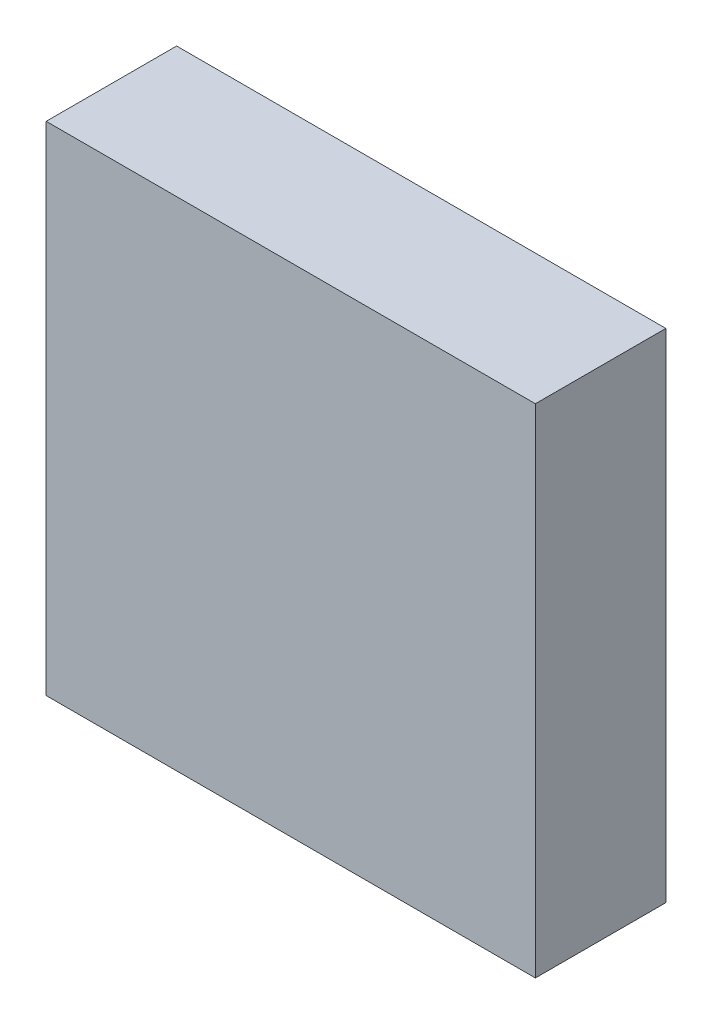
ISO-10303-21;
HEADER;
FILE_DESCRIPTION(('STEP AP214'),'2;1');
FILE_NAME('part.step','',(''),(''),'','','');
FILE_SCHEMA(('AUTOMOTIVE_DESIGN { 1 0 10303 214 1 1 1 1 }'));
ENDSEC;
DATA;
#1=APPLICATION_CONTEXT('core data for automotive mechanical design processes');
#2=APPLICATION_PROTOCOL_DEFINITION('international standard','automotive_design',2000,#1);
#3=PRODUCT_CONTEXT('',#1,'mechanical');
#4=PRODUCT('Part','Part','',(#3));
#5=PRODUCT_RELATED_PRODUCT_CATEGORY('part','',(#4));
#6=PRODUCT_DEFINITION_FORMATION('','',#4);
#7=PRODUCT_DEFINITION_CONTEXT('part definition',#1,'design');
#8=PRODUCT_DEFINITION('design','',#6,#7);
#9=PRODUCT_DEFINITION_SHAPE('','',#8);
#10=(LENGTH_UNIT() NAMED_UNIT(*) SI_UNIT(.MILLI.,.METRE.));
#11=(NAMED_UNIT(*) PLANE_ANGLE_UNIT() SI_UNIT($,.RADIAN.));
#12=(NAMED_UNIT(*) SI_UNIT($,.STERADIAN.) SOLID_ANGLE_UNIT());
#13=UNCERTAINTY_MEASURE_WITH_UNIT(LENGTH_MEASURE(1.E-05),#10,'distance_accuracy_value','');
#14=(GEOMETRIC_REPRESENTATION_CONTEXT(3) GLOBAL_UNCERTAINTY_ASSIGNED_CONTEXT((#13)) GLOBAL_UNIT_ASSIGNED_CONTEXT((#10,
#11,#12)) REPRESENTATION_CONTEXT('',''));
#15=CARTESIAN_POINT('',(0.,0.,0.));
#16=DIRECTION('',(0.,0.,1.));
#17=DIRECTION('',(1.,0.,0.));
#18=AXIS2_PLACEMENT_3D('',#15,#16,#17);
#19=CARTESIAN_POINT('',(-78.3793602910264,-15.7187201468237,2.85762877069288));
#20=DIRECTION('',(-0.999999998763975,2.36279123509077E-06,4.96635296327949E-05));
#21=DIRECTION('',(2.36279123800464E-06,0.999999999997209,0.));
#22=AXIS2_PLACEMENT_3D('',#19,#20,#21);
#23=PLANE('',#22);
#24=DIRECTION('',(-2.36279123509078E-06,-0.999999999997209,5.86721442872066E-11));
#25=VECTOR('',#24,1.);
#26=CARTESIAN_POINT('',(-78.3793602910264,-15.7187201468237,2.85762877069288));
#27=LINE('',#26,#25);
#28=CARTESIAN_POINT('',(-78.3793602910264,-15.7187201468237,2.85762877069288));
#29=VERTEX_POINT('',#28);
#30=CARTESIAN_POINT('',(-78.3793674975432,-18.7687216668152,2.85762877087183));
#31=VERTEX_POINT('',#30);
#32=EDGE_CURVE('E82',#29,#31,#27,.T.);
#33=ORIENTED_EDGE('',*,*,#32,.T.);
#34=DIRECTION('',(-4.96635296327949E-05,5.86724083053525E-11,-0.999999998766767));
#35=VECTOR('',#34,1.);
#36=CARTESIAN_POINT('',(-78.3793674975432,-18.7687216668152,2.85762877087183));
#37=LINE('',#36,#35);
#38=CARTESIAN_POINT('',(-78.3794072284136,-18.7687216667683,2.05762783185842));
#39=VERTEX_POINT('',#38);
#40=EDGE_CURVE('E11',#31,#39,#37,.T.);
#41=ORIENTED_EDGE('',*,*,#40,.T.);
#42=DIRECTION('',(-2.36279123509078E-06,-0.999999999997209,5.86721442872066E-11));
#43=VECTOR('',#42,1.);
#44=CARTESIAN_POINT('',(-78.3794000218968,-15.7187201467768,2.05762783167947));
#45=LINE('',#44,#43);
#46=CARTESIAN_POINT('',(-78.3794000218968,-15.7187201467768,2.05762783167947));
#47=VERTEX_POINT('',#46);
#48=EDGE_CURVE('E88',#47,#39,#45,.T.);
#49=ORIENTED_EDGE('',*,*,#48,.F.);
#50=DIRECTION('',(-4.96635296327949E-05,5.86724083053525E-11,-0.999999998766767));
#51=VECTOR('',#50,1.);
#52=CARTESIAN_POINT('',(-78.3793602910264,-15.7187201468237,2.85762877069288));
#53=LINE('',#52,#51);
#54=EDGE_CURVE('E70',#29,#47,#53,.T.);
#55=ORIENTED_EDGE('',*,*,#54,.F.);
#56=EDGE_LOOP('',(#33,#41,#49,#55));
#57=FACE_BOUND('',#56,.T.);
#58=ADVANCED_FACE('F17',(#57),#23,.F.);
#59=CARTESIAN_POINT('',(-78.3793674975432,-18.7687216668152,2.85762877087183));
#60=DIRECTION('',(2.36279123509078E-06,0.999999999997209,-5.86721442872066E-11));
#61=DIRECTION('',(-2.4831708954119E-05,0.,-0.999999999691693));
#62=AXIS2_PLACEMENT_3D('',#59,#60,#61);
#63=PLANE('',#62);
#64=DIRECTION('',(-0.999999998763976,2.36279123509077E-06,4.96635296327949E-05));
#65=VECTOR('',#64,1.);
#66=CARTESIAN_POINT('',(-78.3793674975432,-18.7687216668152,2.85762877087183));
#67=LINE('',#66,#65);
#68=CARTESIAN_POINT('',(-81.3793665738352,-18.7687145784437,2.85777776141504));
#69=VERTEX_POINT('',#68);
#70=EDGE_CURVE('E101',#31,#69,#67,.T.);
#71=ORIENTED_EDGE('',*,*,#70,.T.);
#72=DIRECTION('',(-4.96635296327949E-05,5.86724083053525E-11,-0.999999998766767));
#73=VECTOR('',#72,1.);
#74=CARTESIAN_POINT('',(-81.3793665738352,-18.7687145784437,2.85777776141504));
#75=LINE('',#74,#73);
#76=CARTESIAN_POINT('',(-81.3794063047055,-18.7687145783967,2.05777682240163));
#77=VERTEX_POINT('',#76);
#78=EDGE_CURVE('E25',#69,#77,#75,.T.);
#79=ORIENTED_EDGE('',*,*,#78,.T.);
#80=DIRECTION('',(-0.999999998763976,2.36279123509077E-06,4.96635296327949E-05));
#81=VECTOR('',#80,1.);
#82=CARTESIAN_POINT('',(-78.3794072284136,-18.7687216667683,2.05762783185842));
#83=LINE('',#82,#81);
#84=EDGE_CURVE('E93',#39,#77,#83,.T.);
#85=ORIENTED_EDGE('',*,*,#84,.F.);
#86=ORIENTED_EDGE('',*,*,#40,.F.);
#87=EDGE_LOOP('',(#71,#79,#85,#86));
#88=FACE_BOUND('',#87,.T.);
#89=ADVANCED_FACE('F117',(#88),#63,.F.);
#90=CARTESIAN_POINT('',(-81.3793665738352,-18.7687145784437,2.85777776141504));
#91=DIRECTION('',(0.999999998763975,-2.36279123509077E-06,-4.96635296327949E-05));
#92=DIRECTION('',(0.,-0.998870180553423,0.0475222305997091));
#93=AXIS2_PLACEMENT_3D('',#90,#91,#92);
#94=PLANE('',#93);
#95=DIRECTION('',(2.36279123509078E-06,0.999999999997209,-5.86721442872066E-11));
#96=VECTOR('',#95,1.);
#97=CARTESIAN_POINT('',(-81.3793665738352,-18.7687145784437,2.85777776141504));
#98=LINE('',#97,#96);
#99=CARTESIAN_POINT('',(-81.3793593673183,-15.7187130584522,2.85777776123609));
#100=VERTEX_POINT('',#99);
#101=EDGE_CURVE('E103',#69,#100,#98,.T.);
#102=ORIENTED_EDGE('',*,*,#101,.T.);
#103=DIRECTION('',(-4.96635296327949E-05,5.86724083053525E-11,-0.999999998766767));
#104=VECTOR('',#103,1.);
#105=CARTESIAN_POINT('',(-81.3793593673183,-15.7187130584522,2.85777776123609));
#106=LINE('',#105,#104);
#107=CARTESIAN_POINT('',(-81.3793990981887,-15.7187130584052,2.05777682222268));
#108=VERTEX_POINT('',#107);
#109=EDGE_CURVE('E81',#100,#108,#106,.T.);
#110=ORIENTED_EDGE('',*,*,#109,.T.);
#111=DIRECTION('',(2.36279123509078E-06,0.999999999997209,-5.86721442872066E-11));
#112=VECTOR('',#111,1.);
#113=CARTESIAN_POINT('',(-81.3794063047055,-18.7687145783967,2.05777682240163));
#114=LINE('',#113,#112);
#115=EDGE_CURVE('E89',#77,#108,#114,.T.);
#116=ORIENTED_EDGE('',*,*,#115,.F.);
#117=ORIENTED_EDGE('',*,*,#78,.F.);
#118=EDGE_LOOP('',(#102,#110,#116,#117));
#119=FACE_BOUND('',#118,.T.);
#120=ADVANCED_FACE('F120',(#119),#94,.F.);
#121=CARTESIAN_POINT('',(-81.3793593673183,-15.7187130584522,2.85777776123609));
#122=DIRECTION('',(-2.36279123509078E-06,-0.999999999997209,5.86721442872066E-11));
#123=DIRECTION('',(-0.999999999997209,2.36279123509078E-06,0.));
#124=AXIS2_PLACEMENT_3D('',#121,#122,#123);
#125=PLANE('',#124);
#126=DIRECTION('',(0.999999998763976,-2.36279123509077E-06,-4.96635296327949E-05));
#127=VECTOR('',#126,1.);
#128=CARTESIAN_POINT('',(-81.3793593673183,-15.7187130584522,2.85777776123609));
#129=LINE('',#128,#127);
#130=EDGE_CURVE('E76',#100,#29,#129,.T.);
#131=ORIENTED_EDGE('',*,*,#130,.T.);
#132=ORIENTED_EDGE('',*,*,#54,.T.);
#133=DIRECTION('',(0.999999998763976,-2.36279123509077E-06,-4.96635296327949E-05));
#134=VECTOR('',#133,1.);
#135=CARTESIAN_POINT('',(-81.3793990981887,-15.7187130584052,2.05777682222268));
#136=LINE('',#135,#134);
#137=EDGE_CURVE('E73',#108,#47,#136,.T.);
#138=ORIENTED_EDGE('',*,*,#137,.F.);
#139=ORIENTED_EDGE('',*,*,#109,.F.);
#140=EDGE_LOOP('',(#131,#132,#138,#139));
#141=FACE_BOUND('',#140,.T.);
#142=ADVANCED_FACE('F72',(#141),#125,.F.);
#143=CARTESIAN_POINT('',(-78.3793602910264,-15.7187201468237,2.85762877069288));
#144=DIRECTION('',(4.96635296327949E-05,-5.86724083053525E-11,0.999999998766767));
#145=DIRECTION('',(-1.18139827634337E-06,-0.999999999999302,0.));
#146=AXIS2_PLACEMENT_3D('',#143,#144,#145);
#147=PLANE('',#146);
#148=ORIENTED_EDGE('',*,*,#130,.F.);
#149=ORIENTED_EDGE('',*,*,#101,.F.);
#150=ORIENTED_EDGE('',*,*,#70,.F.);
#151=ORIENTED_EDGE('',*,*,#32,.F.);
#152=EDGE_LOOP('',(#148,#149,#150,#151));
#153=FACE_BOUND('',#152,.T.);
#154=ADVANCED_FACE('F122',(#153),#147,.T.);
#155=CARTESIAN_POINT('',(-78.3794000218968,-15.7187201467768,2.05762783167947));
#156=DIRECTION('',(4.96635296327949E-05,-5.86724083053525E-11,0.999999998766767));
#157=DIRECTION('',(-1.18139827634337E-06,-0.999999999999302,0.));
#158=AXIS2_PLACEMENT_3D('',#155,#156,#157);
#159=PLANE('',#158);
#160=ORIENTED_EDGE('',*,*,#48,.T.);
#161=ORIENTED_EDGE('',*,*,#84,.T.);
#162=ORIENTED_EDGE('',*,*,#115,.T.);
#163=ORIENTED_EDGE('',*,*,#137,.T.);
#164=EDGE_LOOP('',(#160,#161,#162,#163));
#165=FACE_BOUND('',#164,.T.);
#166=ADVANCED_FACE('F86',(#165),#159,.F.);
#167=CLOSED_SHELL('',(#58,#89,#120,#142,#154,#166));
#168=MANIFOLD_SOLID_BREP('B1',#167);
#169=ADVANCED_BREP_SHAPE_REPRESENTATION('',(#18,#168),#14);
#170=SHAPE_DEFINITION_REPRESENTATION(#9,#169);
ENDSEC;
END-ISO-10303-21;
